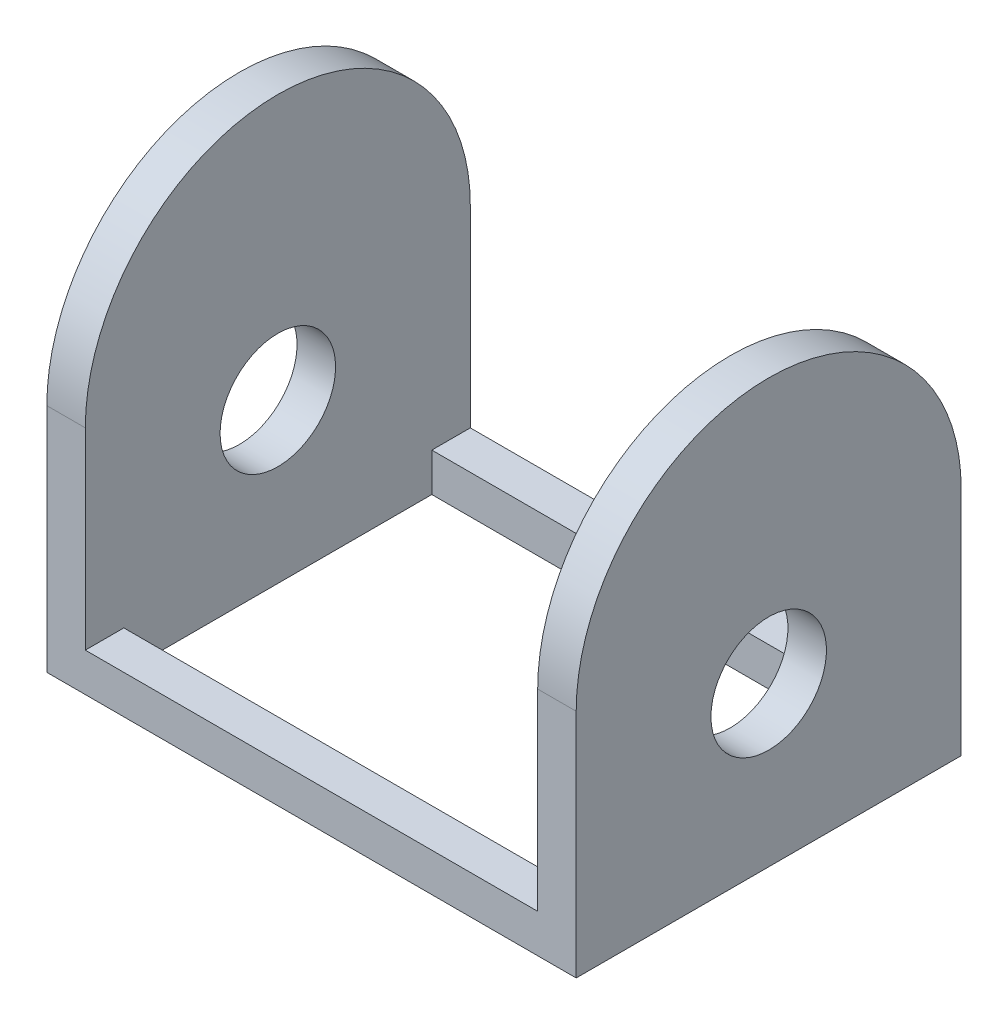
ISO-10303-21;
HEADER;
FILE_DESCRIPTION(('STEP AP214'),'2;1');
FILE_NAME('part.step','',(''),(''),'','','');
FILE_SCHEMA(('AUTOMOTIVE_DESIGN { 1 0 10303 214 1 1 1 1 }'));
ENDSEC;
DATA;
#1=APPLICATION_CONTEXT('core data for automotive mechanical design processes');
#2=APPLICATION_PROTOCOL_DEFINITION('international standard','automotive_design',2000,#1);
#3=PRODUCT_CONTEXT('',#1,'mechanical');
#4=PRODUCT('Part','Part','',(#3));
#5=PRODUCT_RELATED_PRODUCT_CATEGORY('part','',(#4));
#6=PRODUCT_DEFINITION_FORMATION('','',#4);
#7=PRODUCT_DEFINITION_CONTEXT('part definition',#1,'design');
#8=PRODUCT_DEFINITION('design','',#6,#7);
#9=PRODUCT_DEFINITION_SHAPE('','',#8);
#10=(LENGTH_UNIT() NAMED_UNIT(*) SI_UNIT(.MILLI.,.METRE.));
#11=(NAMED_UNIT(*) PLANE_ANGLE_UNIT() SI_UNIT($,.RADIAN.));
#12=(NAMED_UNIT(*) SI_UNIT($,.STERADIAN.) SOLID_ANGLE_UNIT());
#13=UNCERTAINTY_MEASURE_WITH_UNIT(LENGTH_MEASURE(1.E-05),#10,'distance_accuracy_value','');
#14=(GEOMETRIC_REPRESENTATION_CONTEXT(3) GLOBAL_UNCERTAINTY_ASSIGNED_CONTEXT((#13)) GLOBAL_UNIT_ASSIGNED_CONTEXT((#10,
#11,#12)) REPRESENTATION_CONTEXT('',''));
#15=CARTESIAN_POINT('',(0.,0.,0.));
#16=DIRECTION('',(0.,0.,1.));
#17=DIRECTION('',(1.,0.,0.));
#18=AXIS2_PLACEMENT_3D('',#15,#16,#17);
#19=CARTESIAN_POINT('',(0.,4.,0.));
#20=DIRECTION('',(0.,1.,0.));
#21=DIRECTION('',(0.,0.,1.));
#22=AXIS2_PLACEMENT_3D('',#19,#20,#21);
#23=PLANE('',#22);
#24=DIRECTION('',(0.,0.,-1.));
#25=VECTOR('',#24,1.);
#26=CARTESIAN_POINT('',(-23.5,4.,-20.));
#27=LINE('',#26,#25);
#28=CARTESIAN_POINT('',(-23.5,4.,-16.));
#29=VERTEX_POINT('',#28);
#30=CARTESIAN_POINT('',(-23.5,4.,-20.));
#31=VERTEX_POINT('',#30);
#32=EDGE_CURVE('E244',#29,#31,#27,.T.);
#33=ORIENTED_EDGE('',*,*,#32,.F.);
#34=DIRECTION('',(1.,0.,0.));
#35=VECTOR('',#34,1.);
#36=CARTESIAN_POINT('',(0.,4.,-16.));
#37=LINE('',#36,#35);
#38=CARTESIAN_POINT('',(23.5,4.,-16.));
#39=VERTEX_POINT('',#38);
#40=EDGE_CURVE('E158',#29,#39,#37,.T.);
#41=ORIENTED_EDGE('',*,*,#40,.T.);
#42=DIRECTION('',(0.,0.,-1.));
#43=VECTOR('',#42,1.);
#44=CARTESIAN_POINT('',(23.5,4.,-20.));
#45=LINE('',#44,#43);
#46=CARTESIAN_POINT('',(23.5,4.,-20.));
#47=VERTEX_POINT('',#46);
#48=EDGE_CURVE('E201',#39,#47,#45,.T.);
#49=ORIENTED_EDGE('',*,*,#48,.T.);
#50=DIRECTION('',(-1.,0.,0.));
#51=VECTOR('',#50,1.);
#52=CARTESIAN_POINT('',(-27.5,4.,-20.));
#53=LINE('',#52,#51);
#54=EDGE_CURVE('E256',#47,#31,#53,.T.);
#55=ORIENTED_EDGE('',*,*,#54,.T.);
#56=EDGE_LOOP('',(#33,#41,#49,#55));
#57=FACE_BOUND('',#56,.T.);
#58=ADVANCED_FACE('F44',(#57),#23,.T.);
#59=CARTESIAN_POINT('',(-27.5,4.,-20.));
#60=DIRECTION('',(1.,0.,0.));
#61=DIRECTION('',(0.,0.,-1.));
#62=AXIS2_PLACEMENT_3D('',#59,#60,#61);
#63=PLANE('',#62);
#64=CARTESIAN_POINT('',(-27.5,16.5,0.));
#65=DIRECTION('',(-1.,0.,0.));
#66=DIRECTION('',(0.,0.,1.));
#67=AXIS2_PLACEMENT_3D('',#64,#65,#66);
#68=CIRCLE('',#67,6.);
#69=CARTESIAN_POINT('',(-27.5,16.5,6.));
#70=VERTEX_POINT('',#69);
#71=EDGE_CURVE('E225',#70,#70,#68,.T.);
#72=ORIENTED_EDGE('',*,*,#71,.F.);
#73=EDGE_LOOP('',(#72));
#74=FACE_BOUND('',#73,.T.);
#75=DIRECTION('',(0.,0.,1.));
#76=VECTOR('',#75,1.);
#77=CARTESIAN_POINT('',(-27.5,0.,-20.));
#78=LINE('',#77,#76);
#79=CARTESIAN_POINT('',(-27.5,0.,-20.));
#80=VERTEX_POINT('',#79);
#81=CARTESIAN_POINT('',(-27.5,0.,20.));
#82=VERTEX_POINT('',#81);
#83=EDGE_CURVE('E251',#80,#82,#78,.T.);
#84=ORIENTED_EDGE('',*,*,#83,.T.);
#85=DIRECTION('',(0.,-1.,0.));
#86=VECTOR('',#85,1.);
#87=CARTESIAN_POINT('',(-27.5,4.,20.));
#88=LINE('',#87,#86);
#89=CARTESIAN_POINT('',(-27.5,24.,20.));
#90=VERTEX_POINT('',#89);
#91=EDGE_CURVE('E11',#90,#82,#88,.T.);
#92=ORIENTED_EDGE('',*,*,#91,.F.);
#93=CARTESIAN_POINT('',(-27.5,24.,0.));
#94=DIRECTION('',(-1.,0.,0.));
#95=DIRECTION('',(0.,0.,-1.));
#96=AXIS2_PLACEMENT_3D('',#93,#94,#95);
#97=CIRCLE('',#96,20.);
#98=CARTESIAN_POINT('',(-27.5,24.,-20.));
#99=VERTEX_POINT('',#98);
#100=EDGE_CURVE('E220',#90,#99,#97,.T.);
#101=ORIENTED_EDGE('',*,*,#100,.T.);
#102=DIRECTION('',(0.,-1.,0.));
#103=VECTOR('',#102,1.);
#104=CARTESIAN_POINT('',(-27.5,4.,-20.));
#105=LINE('',#104,#103);
#106=EDGE_CURVE('E54',#99,#80,#105,.T.);
#107=ORIENTED_EDGE('',*,*,#106,.T.);
#108=EDGE_LOOP('',(#84,#92,#101,#107));
#109=FACE_BOUND('',#108,.T.);
#110=ADVANCED_FACE('F46',(#74,#109),#63,.F.);
#111=CARTESIAN_POINT('',(-27.5,4.,20.));
#112=DIRECTION('',(0.,0.,-1.));
#113=DIRECTION('',(-1.,0.,0.));
#114=AXIS2_PLACEMENT_3D('',#111,#112,#113);
#115=PLANE('',#114);
#116=DIRECTION('',(1.,0.,0.));
#117=VECTOR('',#116,1.);
#118=CARTESIAN_POINT('',(-27.5,0.,20.));
#119=LINE('',#118,#117);
#120=CARTESIAN_POINT('',(27.5,0.,20.));
#121=VERTEX_POINT('',#120);
#122=EDGE_CURVE('E264',#82,#121,#119,.T.);
#123=ORIENTED_EDGE('',*,*,#122,.T.);
#124=DIRECTION('',(0.,-1.,0.));
#125=VECTOR('',#124,1.);
#126=CARTESIAN_POINT('',(27.5,4.,20.));
#127=LINE('',#126,#125);
#128=CARTESIAN_POINT('',(27.5,24.,20.));
#129=VERTEX_POINT('',#128);
#130=EDGE_CURVE('E212',#129,#121,#127,.T.);
#131=ORIENTED_EDGE('',*,*,#130,.F.);
#132=DIRECTION('',(-1.,0.,0.));
#133=VECTOR('',#132,1.);
#134=CARTESIAN_POINT('',(27.5,24.,20.));
#135=LINE('',#134,#133);
#136=CARTESIAN_POINT('',(23.5,24.,20.));
#137=VERTEX_POINT('',#136);
#138=EDGE_CURVE('E192',#129,#137,#135,.T.);
#139=ORIENTED_EDGE('',*,*,#138,.T.);
#140=DIRECTION('',(0.,-1.,0.));
#141=VECTOR('',#140,1.);
#142=CARTESIAN_POINT('',(23.5,24.,20.));
#143=LINE('',#142,#141);
#144=CARTESIAN_POINT('',(23.5,4.,20.));
#145=VERTEX_POINT('',#144);
#146=EDGE_CURVE('E197',#137,#145,#143,.T.);
#147=ORIENTED_EDGE('',*,*,#146,.T.);
#148=DIRECTION('',(1.,0.,0.));
#149=VECTOR('',#148,1.);
#150=CARTESIAN_POINT('',(-27.5,4.,20.));
#151=LINE('',#150,#149);
#152=CARTESIAN_POINT('',(-23.5,4.,20.));
#153=VERTEX_POINT('',#152);
#154=EDGE_CURVE('E252',#153,#145,#151,.T.);
#155=ORIENTED_EDGE('',*,*,#154,.F.);
#156=DIRECTION('',(0.,-1.,0.));
#157=VECTOR('',#156,1.);
#158=CARTESIAN_POINT('',(-23.5,24.,20.));
#159=LINE('',#158,#157);
#160=CARTESIAN_POINT('',(-23.5,24.,20.));
#161=VERTEX_POINT('',#160);
#162=EDGE_CURVE('E248',#161,#153,#159,.T.);
#163=ORIENTED_EDGE('',*,*,#162,.F.);
#164=DIRECTION('',(1.,0.,0.));
#165=VECTOR('',#164,1.);
#166=CARTESIAN_POINT('',(-27.5,24.,20.));
#167=LINE('',#166,#165);
#168=EDGE_CURVE('E233',#90,#161,#167,.T.);
#169=ORIENTED_EDGE('',*,*,#168,.F.);
#170=ORIENTED_EDGE('',*,*,#91,.T.);
#171=EDGE_LOOP('',(#123,#131,#139,#147,#155,#163,#169,#170));
#172=FACE_BOUND('',#171,.T.);
#173=ADVANCED_FACE('F293',(#172),#115,.F.);
#174=CARTESIAN_POINT('',(-27.5,4.,-20.));
#175=DIRECTION('',(0.,0.,1.));
#176=DIRECTION('',(1.,0.,0.));
#177=AXIS2_PLACEMENT_3D('',#174,#175,#176);
#178=PLANE('',#177);
#179=DIRECTION('',(-1.,0.,0.));
#180=VECTOR('',#179,1.);
#181=CARTESIAN_POINT('',(-27.5,0.,-20.));
#182=LINE('',#181,#180);
#183=CARTESIAN_POINT('',(27.5,0.,-20.));
#184=VERTEX_POINT('',#183);
#185=EDGE_CURVE('E257',#184,#80,#182,.T.);
#186=ORIENTED_EDGE('',*,*,#185,.T.);
#187=ORIENTED_EDGE('',*,*,#106,.F.);
#188=DIRECTION('',(-1.,0.,0.));
#189=VECTOR('',#188,1.);
#190=CARTESIAN_POINT('',(-27.5,24.,-20.));
#191=LINE('',#190,#189);
#192=CARTESIAN_POINT('',(-23.5,24.,-20.));
#193=VERTEX_POINT('',#192);
#194=EDGE_CURVE('E237',#193,#99,#191,.T.);
#195=ORIENTED_EDGE('',*,*,#194,.F.);
#196=DIRECTION('',(0.,-1.,0.));
#197=VECTOR('',#196,1.);
#198=CARTESIAN_POINT('',(-23.5,24.,-20.));
#199=LINE('',#198,#197);
#200=EDGE_CURVE('E241',#193,#31,#199,.T.);
#201=ORIENTED_EDGE('',*,*,#200,.T.);
#202=ORIENTED_EDGE('',*,*,#54,.F.);
#203=DIRECTION('',(0.,-1.,0.));
#204=VECTOR('',#203,1.);
#205=CARTESIAN_POINT('',(23.5,24.,-20.));
#206=LINE('',#205,#204);
#207=CARTESIAN_POINT('',(23.5,24.,-20.));
#208=VERTEX_POINT('',#207);
#209=EDGE_CURVE('E204',#208,#47,#206,.T.);
#210=ORIENTED_EDGE('',*,*,#209,.F.);
#211=DIRECTION('',(1.,0.,0.));
#212=VECTOR('',#211,1.);
#213=CARTESIAN_POINT('',(27.5,24.,-20.));
#214=LINE('',#213,#212);
#215=CARTESIAN_POINT('',(27.5,24.,-20.));
#216=VERTEX_POINT('',#215);
#217=EDGE_CURVE('E188',#208,#216,#214,.T.);
#218=ORIENTED_EDGE('',*,*,#217,.T.);
#219=DIRECTION('',(0.,-1.,0.));
#220=VECTOR('',#219,1.);
#221=CARTESIAN_POINT('',(27.5,4.,-20.));
#222=LINE('',#221,#220);
#223=EDGE_CURVE('E216',#216,#184,#222,.T.);
#224=ORIENTED_EDGE('',*,*,#223,.T.);
#225=EDGE_LOOP('',(#186,#187,#195,#201,#202,#210,#218,#224));
#226=FACE_BOUND('',#225,.T.);
#227=ADVANCED_FACE('F285',(#226),#178,.F.);
#228=DIRECTION('',(1.,0.,0.));
#229=VECTOR('',#228,1.);
#230=CARTESIAN_POINT('',(0.,4.,16.));
#231=LINE('',#230,#229);
#232=CARTESIAN_POINT('',(-23.5,4.,16.));
#233=VERTEX_POINT('',#232);
#234=CARTESIAN_POINT('',(23.5,4.,16.));
#235=VERTEX_POINT('',#234);
#236=EDGE_CURVE('E69',#233,#235,#231,.T.);
#237=ORIENTED_EDGE('',*,*,#236,.F.);
#238=EDGE_CURVE('E144',#153,#233,#27,.T.);
#239=ORIENTED_EDGE('',*,*,#238,.F.);
#240=ORIENTED_EDGE('',*,*,#154,.T.);
#241=EDGE_CURVE('E193',#145,#235,#45,.T.);
#242=ORIENTED_EDGE('',*,*,#241,.T.);
#243=EDGE_LOOP('',(#237,#239,#240,#242));
#244=FACE_BOUND('',#243,.T.);
#245=ADVANCED_FACE('F298',(#244),#23,.T.);
#246=CARTESIAN_POINT('',(0.,0.,0.));
#247=DIRECTION('',(0.,1.,0.));
#248=DIRECTION('',(0.,0.,1.));
#249=AXIS2_PLACEMENT_3D('',#246,#247,#248);
#250=PLANE('',#249);
#251=DIRECTION('',(1.,0.,0.));
#252=VECTOR('',#251,1.);
#253=CARTESIAN_POINT('',(0.,0.,-16.));
#254=LINE('',#253,#252);
#255=CARTESIAN_POINT('',(-23.5,0.,-16.));
#256=VERTEX_POINT('',#255);
#257=CARTESIAN_POINT('',(23.5,0.,-16.));
#258=VERTEX_POINT('',#257);
#259=EDGE_CURVE('E147',#256,#258,#254,.T.);
#260=ORIENTED_EDGE('',*,*,#259,.F.);
#261=DIRECTION('',(0.,0.,1.));
#262=VECTOR('',#261,1.);
#263=CARTESIAN_POINT('',(-23.5,0.,0.));
#264=LINE('',#263,#262);
#265=CARTESIAN_POINT('',(-23.5,0.,16.));
#266=VERTEX_POINT('',#265);
#267=EDGE_CURVE('E141',#256,#266,#264,.T.);
#268=ORIENTED_EDGE('',*,*,#267,.T.);
#269=DIRECTION('',(1.,0.,0.));
#270=VECTOR('',#269,1.);
#271=CARTESIAN_POINT('',(0.,0.,16.));
#272=LINE('',#271,#270);
#273=CARTESIAN_POINT('',(23.5,0.,16.));
#274=VERTEX_POINT('',#273);
#275=EDGE_CURVE('E150',#266,#274,#272,.T.);
#276=ORIENTED_EDGE('',*,*,#275,.T.);
#277=DIRECTION('',(0.,0.,-1.));
#278=VECTOR('',#277,1.);
#279=CARTESIAN_POINT('',(23.5,0.,0.));
#280=LINE('',#279,#278);
#281=EDGE_CURVE('E62',#274,#258,#280,.T.);
#282=ORIENTED_EDGE('',*,*,#281,.T.);
#283=EDGE_LOOP('',(#260,#268,#276,#282));
#284=FACE_BOUND('',#283,.T.);
#285=ORIENTED_EDGE('',*,*,#83,.F.);
#286=ORIENTED_EDGE('',*,*,#185,.F.);
#287=DIRECTION('',(0.,0.,1.));
#288=VECTOR('',#287,1.);
#289=CARTESIAN_POINT('',(27.5,0.,-20.));
#290=LINE('',#289,#288);
#291=EDGE_CURVE('E208',#184,#121,#290,.T.);
#292=ORIENTED_EDGE('',*,*,#291,.T.);
#293=ORIENTED_EDGE('',*,*,#122,.F.);
#294=EDGE_LOOP('',(#285,#286,#292,#293));
#295=FACE_BOUND('',#294,.T.);
#296=ADVANCED_FACE('F155',(#284,#295),#250,.F.);
#297=CARTESIAN_POINT('',(-23.5,24.,-20.));
#298=DIRECTION('',(-1.,0.,0.));
#299=DIRECTION('',(0.,0.,1.));
#300=AXIS2_PLACEMENT_3D('',#297,#298,#299);
#301=PLANE('',#300);
#302=CARTESIAN_POINT('',(-23.5,16.5,0.));
#303=DIRECTION('',(-1.,0.,0.));
#304=DIRECTION('',(0.,0.,1.));
#305=AXIS2_PLACEMENT_3D('',#302,#303,#304);
#306=CIRCLE('',#305,6.);
#307=CARTESIAN_POINT('',(-23.5,16.5,6.));
#308=VERTEX_POINT('',#307);
#309=EDGE_CURVE('E232',#308,#308,#306,.T.);
#310=ORIENTED_EDGE('',*,*,#309,.T.);
#311=EDGE_LOOP('',(#310));
#312=FACE_BOUND('',#311,.T.);
#313=ORIENTED_EDGE('',*,*,#238,.T.);
#314=DIRECTION('',(0.,1.,0.));
#315=VECTOR('',#314,1.);
#316=CARTESIAN_POINT('',(-23.5,0.,16.));
#317=LINE('',#316,#315);
#318=EDGE_CURVE('E137',#266,#233,#317,.T.);
#319=ORIENTED_EDGE('',*,*,#318,.F.);
#320=ORIENTED_EDGE('',*,*,#267,.F.);
#321=DIRECTION('',(0.,1.,0.));
#322=VECTOR('',#321,1.);
#323=CARTESIAN_POINT('',(-23.5,0.,-16.));
#324=LINE('',#323,#322);
#325=EDGE_CURVE('E170',#256,#29,#324,.T.);
#326=ORIENTED_EDGE('',*,*,#325,.T.);
#327=ORIENTED_EDGE('',*,*,#32,.T.);
#328=ORIENTED_EDGE('',*,*,#200,.F.);
#329=CARTESIAN_POINT('',(-23.5,24.,0.));
#330=DIRECTION('',(-1.,0.,0.));
#331=DIRECTION('',(0.,0.,1.));
#332=AXIS2_PLACEMENT_3D('',#329,#330,#331);
#333=CIRCLE('',#332,20.);
#334=EDGE_CURVE('E221',#193,#161,#333,.F.);
#335=ORIENTED_EDGE('',*,*,#334,.T.);
#336=ORIENTED_EDGE('',*,*,#162,.T.);
#337=EDGE_LOOP('',(#313,#319,#320,#326,#327,#328,#335,#336));
#338=FACE_BOUND('',#337,.T.);
#339=ADVANCED_FACE('F139',(#312,#338),#301,.F.);
#340=CARTESIAN_POINT('',(0.,16.5,0.));
#341=DIRECTION('',(-1.,0.,0.));
#342=DIRECTION('',(0.,0.,1.));
#343=AXIS2_PLACEMENT_3D('',#340,#341,#342);
#344=CYLINDRICAL_SURFACE('',#343,6.);
#345=ORIENTED_EDGE('',*,*,#71,.T.);
#346=EDGE_LOOP('',(#345));
#347=FACE_BOUND('',#346,.T.);
#348=ORIENTED_EDGE('',*,*,#309,.F.);
#349=EDGE_LOOP('',(#348));
#350=FACE_BOUND('',#349,.T.);
#351=ADVANCED_FACE('F329',(#347,#350),#344,.F.);
#352=CARTESIAN_POINT('',(21.2213595499958,24.,0.));
#353=DIRECTION('',(-1.,0.,0.));
#354=DIRECTION('',(0.,0.,1.));
#355=AXIS2_PLACEMENT_3D('',#352,#353,#354);
#356=CYLINDRICAL_SURFACE('',#355,20.);
#357=ORIENTED_EDGE('',*,*,#334,.F.);
#358=ORIENTED_EDGE('',*,*,#194,.T.);
#359=ORIENTED_EDGE('',*,*,#100,.F.);
#360=ORIENTED_EDGE('',*,*,#168,.T.);
#361=EDGE_LOOP('',(#357,#358,#359,#360));
#362=FACE_BOUND('',#361,.T.);
#363=ADVANCED_FACE('F288',(#362),#356,.T.);
#364=CARTESIAN_POINT('',(27.5,4.,-20.));
#365=DIRECTION('',(1.,0.,0.));
#366=DIRECTION('',(0.,0.,-1.));
#367=AXIS2_PLACEMENT_3D('',#364,#365,#366);
#368=PLANE('',#367);
#369=CARTESIAN_POINT('',(27.5,16.5,0.));
#370=DIRECTION('',(-1.,0.,0.));
#371=DIRECTION('',(0.,0.,1.));
#372=AXIS2_PLACEMENT_3D('',#369,#370,#371);
#373=CIRCLE('',#372,6.);
#374=CARTESIAN_POINT('',(27.5,16.5,6.));
#375=VERTEX_POINT('',#374);
#376=EDGE_CURVE('E182',#375,#375,#373,.T.);
#377=ORIENTED_EDGE('',*,*,#376,.T.);
#378=EDGE_LOOP('',(#377));
#379=FACE_BOUND('',#378,.T.);
#380=ORIENTED_EDGE('',*,*,#291,.F.);
#381=ORIENTED_EDGE('',*,*,#223,.F.);
#382=CARTESIAN_POINT('',(27.5,24.,0.));
#383=DIRECTION('',(-1.,0.,0.));
#384=DIRECTION('',(0.,0.,-1.));
#385=AXIS2_PLACEMENT_3D('',#382,#383,#384);
#386=CIRCLE('',#385,20.);
#387=EDGE_CURVE('E173',#129,#216,#386,.T.);
#388=ORIENTED_EDGE('',*,*,#387,.F.);
#389=ORIENTED_EDGE('',*,*,#130,.T.);
#390=EDGE_LOOP('',(#380,#381,#388,#389));
#391=FACE_BOUND('',#390,.T.);
#392=ADVANCED_FACE('F308',(#379,#391),#368,.T.);
#393=CARTESIAN_POINT('',(23.5,24.,-20.));
#394=DIRECTION('',(-1.,0.,0.));
#395=DIRECTION('',(0.,0.,1.));
#396=AXIS2_PLACEMENT_3D('',#393,#394,#395);
#397=PLANE('',#396);
#398=CARTESIAN_POINT('',(23.5,16.5,0.));
#399=DIRECTION('',(-1.,0.,0.));
#400=DIRECTION('',(0.,0.,1.));
#401=AXIS2_PLACEMENT_3D('',#398,#399,#400);
#402=CIRCLE('',#401,6.);
#403=CARTESIAN_POINT('',(23.5,16.5,6.));
#404=VERTEX_POINT('',#403);
#405=EDGE_CURVE('E48',#404,#404,#402,.F.);
#406=ORIENTED_EDGE('',*,*,#405,.T.);
#407=EDGE_LOOP('',(#406));
#408=FACE_BOUND('',#407,.T.);
#409=ORIENTED_EDGE('',*,*,#241,.F.);
#410=ORIENTED_EDGE('',*,*,#146,.F.);
#411=CARTESIAN_POINT('',(23.5,24.,0.));
#412=DIRECTION('',(1.,0.,0.));
#413=DIRECTION('',(0.,0.,-1.));
#414=AXIS2_PLACEMENT_3D('',#411,#412,#413);
#415=CIRCLE('',#414,20.);
#416=EDGE_CURVE('E179',#208,#137,#415,.T.);
#417=ORIENTED_EDGE('',*,*,#416,.F.);
#418=ORIENTED_EDGE('',*,*,#209,.T.);
#419=ORIENTED_EDGE('',*,*,#48,.F.);
#420=DIRECTION('',(0.,1.,0.));
#421=VECTOR('',#420,1.);
#422=CARTESIAN_POINT('',(23.5,0.,-16.));
#423=LINE('',#422,#421);
#424=EDGE_CURVE('E174',#258,#39,#423,.T.);
#425=ORIENTED_EDGE('',*,*,#424,.F.);
#426=ORIENTED_EDGE('',*,*,#281,.F.);
#427=DIRECTION('',(0.,1.,0.));
#428=VECTOR('',#427,1.);
#429=CARTESIAN_POINT('',(23.5,0.,16.));
#430=LINE('',#429,#428);
#431=EDGE_CURVE('E146',#274,#235,#430,.T.);
#432=ORIENTED_EDGE('',*,*,#431,.T.);
#433=EDGE_LOOP('',(#409,#410,#417,#418,#419,#425,#426,#432));
#434=FACE_BOUND('',#433,.T.);
#435=ADVANCED_FACE('F299',(#408,#434),#397,.T.);
#436=CARTESIAN_POINT('',(-27.5,16.5,0.));
#437=DIRECTION('',(1.,0.,0.));
#438=DIRECTION('',(0.,0.,-1.));
#439=AXIS2_PLACEMENT_3D('',#436,#437,#438);
#440=CYLINDRICAL_SURFACE('',#439,6.);
#441=ORIENTED_EDGE('',*,*,#405,.F.);
#442=EDGE_LOOP('',(#441));
#443=FACE_BOUND('',#442,.T.);
#444=ORIENTED_EDGE('',*,*,#376,.F.);
#445=EDGE_LOOP('',(#444));
#446=FACE_BOUND('',#445,.T.);
#447=ADVANCED_FACE('F315',(#443,#446),#440,.F.);
#448=CARTESIAN_POINT('',(-68.2213595499958,24.,0.));
#449=DIRECTION('',(1.,0.,0.));
#450=DIRECTION('',(0.,0.,-1.));
#451=AXIS2_PLACEMENT_3D('',#448,#449,#450);
#452=CYLINDRICAL_SURFACE('',#451,20.);
#453=ORIENTED_EDGE('',*,*,#217,.F.);
#454=ORIENTED_EDGE('',*,*,#416,.T.);
#455=ORIENTED_EDGE('',*,*,#138,.F.);
#456=ORIENTED_EDGE('',*,*,#387,.T.);
#457=EDGE_LOOP('',(#453,#454,#455,#456));
#458=FACE_BOUND('',#457,.T.);
#459=ADVANCED_FACE('F304',(#458),#452,.T.);
#460=CARTESIAN_POINT('',(0.,0.,-16.));
#461=DIRECTION('',(0.,0.,1.));
#462=DIRECTION('',(1.,0.,0.));
#463=AXIS2_PLACEMENT_3D('',#460,#461,#462);
#464=PLANE('',#463);
#465=ORIENTED_EDGE('',*,*,#40,.F.);
#466=ORIENTED_EDGE('',*,*,#325,.F.);
#467=ORIENTED_EDGE('',*,*,#259,.T.);
#468=ORIENTED_EDGE('',*,*,#424,.T.);
#469=EDGE_LOOP('',(#465,#466,#467,#468));
#470=FACE_BOUND('',#469,.T.);
#471=ADVANCED_FACE('F456',(#470),#464,.T.);
#472=CARTESIAN_POINT('',(0.,0.,16.));
#473=DIRECTION('',(0.,0.,1.));
#474=DIRECTION('',(1.,0.,0.));
#475=AXIS2_PLACEMENT_3D('',#472,#473,#474);
#476=PLANE('',#475);
#477=ORIENTED_EDGE('',*,*,#236,.T.);
#478=ORIENTED_EDGE('',*,*,#431,.F.);
#479=ORIENTED_EDGE('',*,*,#275,.F.);
#480=ORIENTED_EDGE('',*,*,#318,.T.);
#481=EDGE_LOOP('',(#477,#478,#479,#480));
#482=FACE_BOUND('',#481,.T.);
#483=ADVANCED_FACE('F151',(#482),#476,.F.);
#484=CLOSED_SHELL('',(#58,#110,#173,#227,#245,#296,#339,#351,#363,#392,#435,#447,#459,#471,#483));
#485=MANIFOLD_SOLID_BREP('B2',#484);
#486=ADVANCED_BREP_SHAPE_REPRESENTATION('',(#18,#485),#14);
#487=SHAPE_DEFINITION_REPRESENTATION(#9,#486);
ENDSEC;
END-ISO-10303-21;
